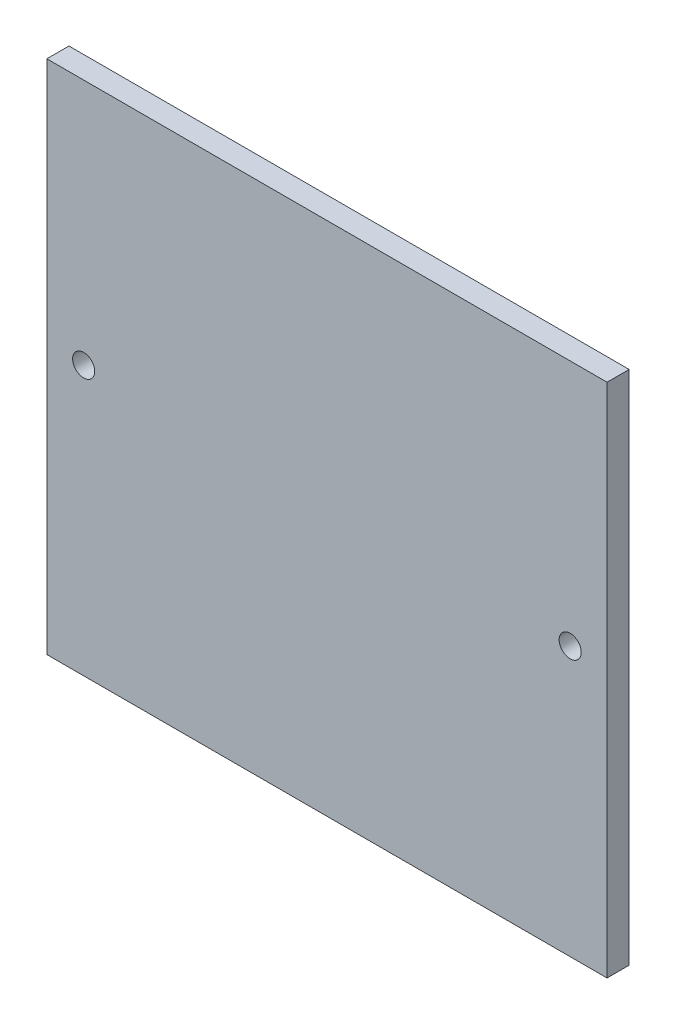
ISO-10303-21;
HEADER;
FILE_DESCRIPTION(('STEP AP214'),'2;1');
FILE_NAME('part.step','',(''),(''),'','','');
FILE_SCHEMA(('AUTOMOTIVE_DESIGN { 1 0 10303 214 1 1 1 1 }'));
ENDSEC;
DATA;
#1=APPLICATION_CONTEXT('core data for automotive mechanical design processes');
#2=APPLICATION_PROTOCOL_DEFINITION('international standard','automotive_design',2000,#1);
#3=PRODUCT_CONTEXT('',#1,'mechanical');
#4=PRODUCT('Part','Part','',(#3));
#5=PRODUCT_RELATED_PRODUCT_CATEGORY('part','',(#4));
#6=PRODUCT_DEFINITION_FORMATION('','',#4);
#7=PRODUCT_DEFINITION_CONTEXT('part definition',#1,'design');
#8=PRODUCT_DEFINITION('design','',#6,#7);
#9=PRODUCT_DEFINITION_SHAPE('','',#8);
#10=(LENGTH_UNIT() NAMED_UNIT(*) SI_UNIT(.MILLI.,.METRE.));
#11=(NAMED_UNIT(*) PLANE_ANGLE_UNIT() SI_UNIT($,.RADIAN.));
#12=(NAMED_UNIT(*) SI_UNIT($,.STERADIAN.) SOLID_ANGLE_UNIT());
#13=UNCERTAINTY_MEASURE_WITH_UNIT(LENGTH_MEASURE(1.E-05),#10,'distance_accuracy_value','');
#14=(GEOMETRIC_REPRESENTATION_CONTEXT(3) GLOBAL_UNCERTAINTY_ASSIGNED_CONTEXT((#13)) GLOBAL_UNIT_ASSIGNED_CONTEXT((#10,
#11,#12)) REPRESENTATION_CONTEXT('',''));
#15=CARTESIAN_POINT('',(0.,0.,0.));
#16=DIRECTION('',(0.,0.,1.));
#17=DIRECTION('',(1.,0.,0.));
#18=AXIS2_PLACEMENT_3D('',#15,#16,#17);
#19=CARTESIAN_POINT('',(0.,0.,3.));
#20=DIRECTION('',(0.,0.,1.));
#21=DIRECTION('',(1.,0.,0.));
#22=AXIS2_PLACEMENT_3D('',#19,#20,#21);
#23=PLANE('',#22);
#24=CARTESIAN_POINT('',(-26.5030040086772,-16.7754491017964,3.));
#25=DIRECTION('',(0.,0.,1.));
#26=DIRECTION('',(1.,0.,0.));
#27=AXIS2_PLACEMENT_3D('',#24,#25,#26);
#28=CIRCLE('',#27,1.5);
#29=CARTESIAN_POINT('',(-25.0030040086772,-16.7754491017964,3.));
#30=VERTEX_POINT('',#29);
#31=EDGE_CURVE('E99',#30,#30,#28,.T.);
#32=ORIENTED_EDGE('',*,*,#31,.F.);
#33=EDGE_LOOP('',(#32));
#34=FACE_BOUND('',#33,.T.);
#35=DIRECTION('',(0.,-1.,0.));
#36=VECTOR('',#35,1.);
#37=CARTESIAN_POINT('',(-31.5030040086772,16.7245508982036,3.));
#38=LINE('',#37,#36);
#39=CARTESIAN_POINT('',(-31.5030040086772,16.7245508982036,3.));
#40=VERTEX_POINT('',#39);
#41=CARTESIAN_POINT('',(-31.5030040086771,-53.2754491017964,3.));
#42=VERTEX_POINT('',#41);
#43=EDGE_CURVE('E84',#40,#42,#38,.T.);
#44=ORIENTED_EDGE('',*,*,#43,.T.);
#45=DIRECTION('',(1.,0.,0.));
#46=VECTOR('',#45,1.);
#47=CARTESIAN_POINT('',(-31.5030040086771,-53.2754491017964,3.));
#48=LINE('',#47,#46);
#49=CARTESIAN_POINT('',(44.4969959913229,-53.2754491017964,3.));
#50=VERTEX_POINT('',#49);
#51=EDGE_CURVE('E79',#42,#50,#48,.T.);
#52=ORIENTED_EDGE('',*,*,#51,.T.);
#53=DIRECTION('',(0.,1.,0.));
#54=VECTOR('',#53,1.);
#55=CARTESIAN_POINT('',(44.4969959913228,16.7245508982036,3.));
#56=LINE('',#55,#54);
#57=CARTESIAN_POINT('',(44.4969959913228,16.7245508982036,3.));
#58=VERTEX_POINT('',#57);
#59=EDGE_CURVE('E82',#50,#58,#56,.T.);
#60=ORIENTED_EDGE('',*,*,#59,.T.);
#61=DIRECTION('',(-1.,0.,0.));
#62=VECTOR('',#61,1.);
#63=CARTESIAN_POINT('',(-31.5030040086772,16.7245508982036,3.));
#64=LINE('',#63,#62);
#65=EDGE_CURVE('E49',#58,#40,#64,.T.);
#66=ORIENTED_EDGE('',*,*,#65,.T.);
#67=EDGE_LOOP('',(#44,#52,#60,#66));
#68=FACE_BOUND('',#67,.T.);
#69=CARTESIAN_POINT('',(39.4969959913228,-16.7754491017964,3.));
#70=DIRECTION('',(0.,0.,1.));
#71=DIRECTION('',(1.,0.,0.));
#72=AXIS2_PLACEMENT_3D('',#69,#70,#71);
#73=CIRCLE('',#72,1.5);
#74=CARTESIAN_POINT('',(40.9969959913229,-16.7754491017964,3.));
#75=VERTEX_POINT('',#74);
#76=EDGE_CURVE('E114',#75,#75,#73,.T.);
#77=ORIENTED_EDGE('',*,*,#76,.F.);
#78=EDGE_LOOP('',(#77));
#79=FACE_BOUND('',#78,.T.);
#80=ADVANCED_FACE('F32',(#34,#68,#79),#23,.T.);
#81=CARTESIAN_POINT('',(0.,0.,0.));
#82=DIRECTION('',(0.,0.,1.));
#83=DIRECTION('',(1.,0.,0.));
#84=AXIS2_PLACEMENT_3D('',#81,#82,#83);
#85=PLANE('',#84);
#86=CARTESIAN_POINT('',(-26.5030040086772,-16.7754491017964,0.));
#87=DIRECTION('',(0.,0.,1.));
#88=DIRECTION('',(1.,0.,0.));
#89=AXIS2_PLACEMENT_3D('',#86,#87,#88);
#90=CIRCLE('',#89,1.5);
#91=CARTESIAN_POINT('',(-25.0030040086772,-16.7754491017964,0.));
#92=VERTEX_POINT('',#91);
#93=EDGE_CURVE('E111',#92,#92,#90,.T.);
#94=ORIENTED_EDGE('',*,*,#93,.T.);
#95=EDGE_LOOP('',(#94));
#96=FACE_BOUND('',#95,.T.);
#97=DIRECTION('',(0.,-1.,0.));
#98=VECTOR('',#97,1.);
#99=CARTESIAN_POINT('',(-31.5030040086772,16.7245508982036,0.));
#100=LINE('',#99,#98);
#101=CARTESIAN_POINT('',(-31.5030040086772,16.7245508982036,0.));
#102=VERTEX_POINT('',#101);
#103=CARTESIAN_POINT('',(-31.5030040086771,-53.2754491017964,0.));
#104=VERTEX_POINT('',#103);
#105=EDGE_CURVE('E96',#102,#104,#100,.T.);
#106=ORIENTED_EDGE('',*,*,#105,.F.);
#107=DIRECTION('',(-1.,0.,0.));
#108=VECTOR('',#107,1.);
#109=CARTESIAN_POINT('',(-31.5030040086772,16.7245508982036,0.));
#110=LINE('',#109,#108);
#111=CARTESIAN_POINT('',(44.4969959913228,16.7245508982036,0.));
#112=VERTEX_POINT('',#111);
#113=EDGE_CURVE('E72',#112,#102,#110,.T.);
#114=ORIENTED_EDGE('',*,*,#113,.F.);
#115=DIRECTION('',(0.,1.,0.));
#116=VECTOR('',#115,1.);
#117=CARTESIAN_POINT('',(44.4969959913228,16.7245508982036,0.));
#118=LINE('',#117,#116);
#119=CARTESIAN_POINT('',(44.4969959913229,-53.2754491017964,0.));
#120=VERTEX_POINT('',#119);
#121=EDGE_CURVE('E66',#120,#112,#118,.T.);
#122=ORIENTED_EDGE('',*,*,#121,.F.);
#123=DIRECTION('',(1.,0.,0.));
#124=VECTOR('',#123,1.);
#125=CARTESIAN_POINT('',(-31.5030040086771,-53.2754491017964,0.));
#126=LINE('',#125,#124);
#127=EDGE_CURVE('E88',#104,#120,#126,.T.);
#128=ORIENTED_EDGE('',*,*,#127,.F.);
#129=EDGE_LOOP('',(#106,#114,#122,#128));
#130=FACE_BOUND('',#129,.T.);
#131=CARTESIAN_POINT('',(39.4969959913228,-16.7754491017964,0.));
#132=DIRECTION('',(0.,0.,1.));
#133=DIRECTION('',(1.,0.,0.));
#134=AXIS2_PLACEMENT_3D('',#131,#132,#133);
#135=CIRCLE('',#134,1.5);
#136=CARTESIAN_POINT('',(40.9969959913229,-16.7754491017964,0.));
#137=VERTEX_POINT('',#136);
#138=EDGE_CURVE('E117',#137,#137,#135,.T.);
#139=ORIENTED_EDGE('',*,*,#138,.T.);
#140=EDGE_LOOP('',(#139));
#141=FACE_BOUND('',#140,.T.);
#142=ADVANCED_FACE('F107',(#96,#130,#141),#85,.F.);
#143=CARTESIAN_POINT('',(-31.5030040086772,16.7245508982036,3.));
#144=DIRECTION('',(1.,0.,0.));
#145=DIRECTION('',(0.,1.,0.));
#146=AXIS2_PLACEMENT_3D('',#143,#144,#145);
#147=PLANE('',#146);
#148=ORIENTED_EDGE('',*,*,#105,.T.);
#149=DIRECTION('',(0.,0.,-1.));
#150=VECTOR('',#149,1.);
#151=CARTESIAN_POINT('',(-31.5030040086771,-53.2754491017964,3.));
#152=LINE('',#151,#150);
#153=EDGE_CURVE('E11',#42,#104,#152,.T.);
#154=ORIENTED_EDGE('',*,*,#153,.F.);
#155=ORIENTED_EDGE('',*,*,#43,.F.);
#156=DIRECTION('',(0.,0.,-1.));
#157=VECTOR('',#156,1.);
#158=CARTESIAN_POINT('',(-31.5030040086772,16.7245508982036,3.));
#159=LINE('',#158,#157);
#160=EDGE_CURVE('E92',#40,#102,#159,.T.);
#161=ORIENTED_EDGE('',*,*,#160,.T.);
#162=EDGE_LOOP('',(#148,#154,#155,#161));
#163=FACE_BOUND('',#162,.T.);
#164=ADVANCED_FACE('F34',(#163),#147,.F.);
#165=CARTESIAN_POINT('',(-31.5030040086771,-53.2754491017964,3.));
#166=DIRECTION('',(0.,1.,0.));
#167=DIRECTION('',(0.,0.,1.));
#168=AXIS2_PLACEMENT_3D('',#165,#166,#167);
#169=PLANE('',#168);
#170=ORIENTED_EDGE('',*,*,#127,.T.);
#171=DIRECTION('',(0.,0.,-1.));
#172=VECTOR('',#171,1.);
#173=CARTESIAN_POINT('',(44.4969959913229,-53.2754491017964,3.));
#174=LINE('',#173,#172);
#175=EDGE_CURVE('E41',#50,#120,#174,.T.);
#176=ORIENTED_EDGE('',*,*,#175,.F.);
#177=ORIENTED_EDGE('',*,*,#51,.F.);
#178=ORIENTED_EDGE('',*,*,#153,.T.);
#179=EDGE_LOOP('',(#170,#176,#177,#178));
#180=FACE_BOUND('',#179,.T.);
#181=ADVANCED_FACE('F87',(#180),#169,.F.);
#182=CARTESIAN_POINT('',(44.4969959913228,16.7245508982036,3.));
#183=DIRECTION('',(-1.,0.,0.));
#184=DIRECTION('',(0.,-1.,0.));
#185=AXIS2_PLACEMENT_3D('',#182,#183,#184);
#186=PLANE('',#185);
#187=ORIENTED_EDGE('',*,*,#121,.T.);
#188=DIRECTION('',(0.,0.,-1.));
#189=VECTOR('',#188,1.);
#190=CARTESIAN_POINT('',(44.4969959913228,16.7245508982036,3.));
#191=LINE('',#190,#189);
#192=EDGE_CURVE('E89',#58,#112,#191,.T.);
#193=ORIENTED_EDGE('',*,*,#192,.F.);
#194=ORIENTED_EDGE('',*,*,#59,.F.);
#195=ORIENTED_EDGE('',*,*,#175,.T.);
#196=EDGE_LOOP('',(#187,#193,#194,#195));
#197=FACE_BOUND('',#196,.T.);
#198=ADVANCED_FACE('F90',(#197),#186,.F.);
#199=CARTESIAN_POINT('',(-31.5030040086772,16.7245508982036,3.));
#200=DIRECTION('',(0.,-1.,0.));
#201=DIRECTION('',(0.,0.,-1.));
#202=AXIS2_PLACEMENT_3D('',#199,#200,#201);
#203=PLANE('',#202);
#204=ORIENTED_EDGE('',*,*,#113,.T.);
#205=ORIENTED_EDGE('',*,*,#160,.F.);
#206=ORIENTED_EDGE('',*,*,#65,.F.);
#207=ORIENTED_EDGE('',*,*,#192,.T.);
#208=EDGE_LOOP('',(#204,#205,#206,#207));
#209=FACE_BOUND('',#208,.T.);
#210=ADVANCED_FACE('F104',(#209),#203,.F.);
#211=CARTESIAN_POINT('',(-26.5030040086772,-16.7754491017964,3.));
#212=DIRECTION('',(0.,0.,-1.));
#213=DIRECTION('',(-1.,0.,0.));
#214=AXIS2_PLACEMENT_3D('',#211,#212,#213);
#215=CYLINDRICAL_SURFACE('',#214,1.5);
#216=ORIENTED_EDGE('',*,*,#31,.T.);
#217=EDGE_LOOP('',(#216));
#218=FACE_BOUND('',#217,.T.);
#219=ORIENTED_EDGE('',*,*,#93,.F.);
#220=EDGE_LOOP('',(#219));
#221=FACE_BOUND('',#220,.T.);
#222=ADVANCED_FACE('F135',(#218,#221),#215,.F.);
#223=CARTESIAN_POINT('',(39.4969959913228,-16.7754491017964,3.));
#224=DIRECTION('',(0.,0.,-1.));
#225=DIRECTION('',(-1.,0.,0.));
#226=AXIS2_PLACEMENT_3D('',#223,#224,#225);
#227=CYLINDRICAL_SURFACE('',#226,1.5);
#228=ORIENTED_EDGE('',*,*,#76,.T.);
#229=EDGE_LOOP('',(#228));
#230=FACE_BOUND('',#229,.T.);
#231=ORIENTED_EDGE('',*,*,#138,.F.);
#232=EDGE_LOOP('',(#231));
#233=FACE_BOUND('',#232,.T.);
#234=ADVANCED_FACE('F123',(#230,#233),#227,.F.);
#235=CLOSED_SHELL('',(#80,#142,#164,#181,#198,#210,#222,#234));
#236=MANIFOLD_SOLID_BREP('B2',#235);
#237=ADVANCED_BREP_SHAPE_REPRESENTATION('',(#18,#236),#14);
#238=SHAPE_DEFINITION_REPRESENTATION(#9,#237);
ENDSEC;
END-ISO-10303-21;
